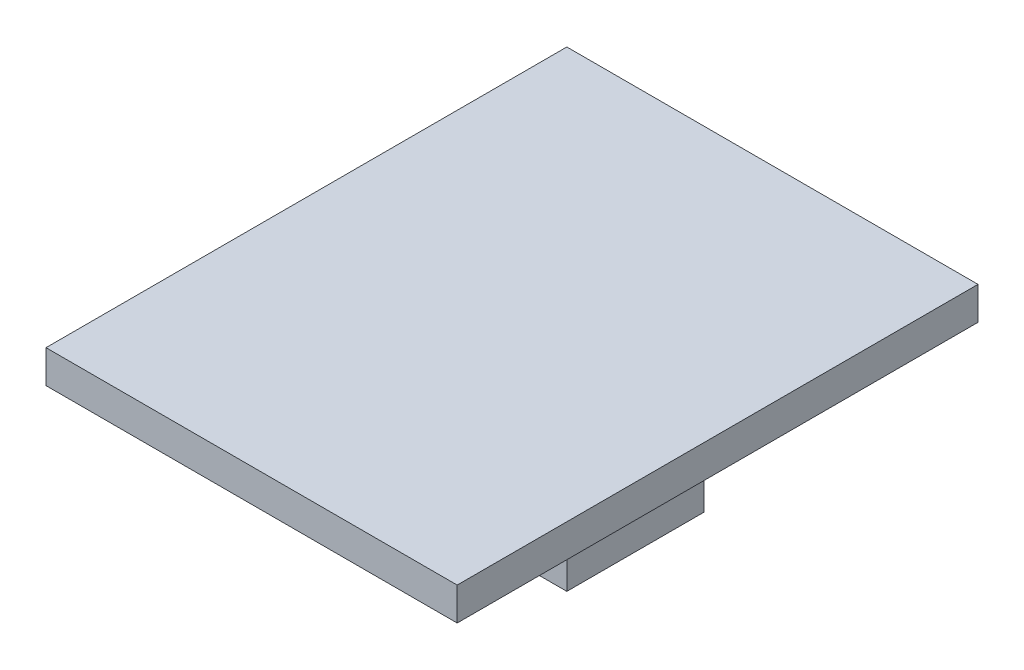
ISO-10303-21;
HEADER;
FILE_DESCRIPTION(('STEP AP214'),'2;1');
FILE_NAME('part.step','',(''),(''),'','','');
FILE_SCHEMA(('AUTOMOTIVE_DESIGN { 1 0 10303 214 1 1 1 1 }'));
ENDSEC;
DATA;
#1=APPLICATION_CONTEXT('core data for automotive mechanical design processes');
#2=APPLICATION_PROTOCOL_DEFINITION('international standard','automotive_design',2000,#1);
#3=PRODUCT_CONTEXT('',#1,'mechanical');
#4=PRODUCT('Part','Part','',(#3));
#5=PRODUCT_RELATED_PRODUCT_CATEGORY('part','',(#4));
#6=PRODUCT_DEFINITION_FORMATION('','',#4);
#7=PRODUCT_DEFINITION_CONTEXT('part definition',#1,'design');
#8=PRODUCT_DEFINITION('design','',#6,#7);
#9=PRODUCT_DEFINITION_SHAPE('','',#8);
#10=(LENGTH_UNIT() NAMED_UNIT(*) SI_UNIT(.MILLI.,.METRE.));
#11=(NAMED_UNIT(*) PLANE_ANGLE_UNIT() SI_UNIT($,.RADIAN.));
#12=(NAMED_UNIT(*) SI_UNIT($,.STERADIAN.) SOLID_ANGLE_UNIT());
#13=UNCERTAINTY_MEASURE_WITH_UNIT(LENGTH_MEASURE(1.E-05),#10,'distance_accuracy_value','');
#14=(GEOMETRIC_REPRESENTATION_CONTEXT(3) GLOBAL_UNCERTAINTY_ASSIGNED_CONTEXT((#13)) GLOBAL_UNIT_ASSIGNED_CONTEXT((#10,
#11,#12)) REPRESENTATION_CONTEXT('',''));
#15=CARTESIAN_POINT('',(0.,0.,0.));
#16=DIRECTION('',(0.,0.,1.));
#17=DIRECTION('',(1.,0.,0.));
#18=AXIS2_PLACEMENT_3D('',#15,#16,#17);
#19=CARTESIAN_POINT('',(0.,-1.2,0.));
#20=DIRECTION('',(0.,1.,0.));
#21=DIRECTION('',(0.,0.,1.));
#22=AXIS2_PLACEMENT_3D('',#19,#20,#21);
#23=PLANE('',#22);
#24=DIRECTION('',(0.,0.,1.));
#25=VECTOR('',#24,1.);
#26=CARTESIAN_POINT('',(-26.3470734694033,-1.2,0.));
#27=LINE('',#26,#25);
#28=CARTESIAN_POINT('',(-26.3470734694033,-1.2,-42.3905157228864));
#29=VERTEX_POINT('',#28);
#30=CARTESIAN_POINT('',(-26.3470734694033,-1.2,-23.3905157228864));
#31=VERTEX_POINT('',#30);
#32=EDGE_CURVE('E153',#29,#31,#27,.T.);
#33=ORIENTED_EDGE('',*,*,#32,.T.);
#34=DIRECTION('',(1.,0.,0.));
#35=VECTOR('',#34,1.);
#36=CARTESIAN_POINT('',(0.,-1.2,-23.3905157228864));
#37=LINE('',#36,#35);
#38=CARTESIAN_POINT('',(-41.3470734694033,-1.2,-23.3905157228864));
#39=VERTEX_POINT('',#38);
#40=EDGE_CURVE('E161',#39,#31,#37,.T.);
#41=ORIENTED_EDGE('',*,*,#40,.F.);
#42=DIRECTION('',(0.,0.,1.));
#43=VECTOR('',#42,1.);
#44=CARTESIAN_POINT('',(-41.3470734694033,-1.2,0.));
#45=LINE('',#44,#43);
#46=CARTESIAN_POINT('',(-41.3470734694033,-1.2,-42.3905157228864));
#47=VERTEX_POINT('',#46);
#48=EDGE_CURVE('E158',#47,#39,#45,.T.);
#49=ORIENTED_EDGE('',*,*,#48,.F.);
#50=DIRECTION('',(1.,0.,0.));
#51=VECTOR('',#50,1.);
#52=CARTESIAN_POINT('',(0.,-1.2,-42.3905157228864));
#53=LINE('',#52,#51);
#54=EDGE_CURVE('E155',#47,#29,#53,.T.);
#55=ORIENTED_EDGE('',*,*,#54,.T.);
#56=EDGE_LOOP('',(#33,#41,#49,#55));
#57=FACE_BOUND('',#56,.T.);
#58=DIRECTION('',(0.,0.,1.));
#59=VECTOR('',#58,1.);
#60=CARTESIAN_POINT('',(-36.3470734694033,-1.2,0.));
#61=LINE('',#60,#59);
#62=CARTESIAN_POINT('',(-36.3470734694033,-1.2,-37.3905157228864));
#63=VERTEX_POINT('',#62);
#64=CARTESIAN_POINT('',(-36.3470734694033,-1.2,-32.3905157228864));
#65=VERTEX_POINT('',#64);
#66=EDGE_CURVE('E340',#63,#65,#61,.T.);
#67=ORIENTED_EDGE('',*,*,#66,.T.);
#68=DIRECTION('',(1.,0.,0.));
#69=VECTOR('',#68,1.);
#70=CARTESIAN_POINT('',(0.,-1.2,-32.3905157228864));
#71=LINE('',#70,#69);
#72=CARTESIAN_POINT('',(-31.3470734694033,-1.2,-32.3905157228864));
#73=VERTEX_POINT('',#72);
#74=EDGE_CURVE('E51',#65,#73,#71,.T.);
#75=ORIENTED_EDGE('',*,*,#74,.T.);
#76=DIRECTION('',(0.,0.,1.));
#77=VECTOR('',#76,1.);
#78=CARTESIAN_POINT('',(-31.3470734694033,-1.2,0.));
#79=LINE('',#78,#77);
#80=CARTESIAN_POINT('',(-31.3470734694033,-1.2,-37.3905157228864));
#81=VERTEX_POINT('',#80);
#82=EDGE_CURVE('E345',#81,#73,#79,.T.);
#83=ORIENTED_EDGE('',*,*,#82,.F.);
#84=DIRECTION('',(1.,0.,0.));
#85=VECTOR('',#84,1.);
#86=CARTESIAN_POINT('',(0.,-1.2,-37.3905157228864));
#87=LINE('',#86,#85);
#88=EDGE_CURVE('E363',#63,#81,#87,.T.);
#89=ORIENTED_EDGE('',*,*,#88,.F.);
#90=EDGE_LOOP('',(#67,#75,#83,#89));
#91=FACE_BOUND('',#90,.T.);
#92=ADVANCED_FACE('F34',(#57,#91),#23,.F.);
#93=CARTESIAN_POINT('',(-26.3470734694033,-1.2,0.));
#94=DIRECTION('',(-1.,0.,0.));
#95=DIRECTION('',(0.,0.,1.));
#96=AXIS2_PLACEMENT_3D('',#93,#94,#95);
#97=PLANE('',#96);
#98=DIRECTION('',(0.,0.,1.));
#99=VECTOR('',#98,1.);
#100=CARTESIAN_POINT('',(-26.3470734694033,0.,0.));
#101=LINE('',#100,#99);
#102=CARTESIAN_POINT('',(-26.3470734694033,0.,-42.3905157228864));
#103=VERTEX_POINT('',#102);
#104=CARTESIAN_POINT('',(-26.3470734694033,0.,-23.3905157228864));
#105=VERTEX_POINT('',#104);
#106=EDGE_CURVE('E147',#103,#105,#101,.T.);
#107=ORIENTED_EDGE('',*,*,#106,.T.);
#108=DIRECTION('',(0.,1.,0.));
#109=VECTOR('',#108,1.);
#110=CARTESIAN_POINT('',(-26.3470734694033,-1.2,-23.3905157228864));
#111=LINE('',#110,#109);
#112=EDGE_CURVE('E11',#31,#105,#111,.T.);
#113=ORIENTED_EDGE('',*,*,#112,.F.);
#114=ORIENTED_EDGE('',*,*,#32,.F.);
#115=DIRECTION('',(0.,1.,0.));
#116=VECTOR('',#115,1.);
#117=CARTESIAN_POINT('',(-26.3470734694033,-1.2,-42.3905157228864));
#118=LINE('',#117,#116);
#119=EDGE_CURVE('E38',#29,#103,#118,.T.);
#120=ORIENTED_EDGE('',*,*,#119,.T.);
#121=EDGE_LOOP('',(#107,#113,#114,#120));
#122=FACE_BOUND('',#121,.T.);
#123=ADVANCED_FACE('F36',(#122),#97,.F.);
#124=CARTESIAN_POINT('',(0.,-1.2,-23.3905157228864));
#125=DIRECTION('',(0.,0.,1.));
#126=DIRECTION('',(1.,0.,0.));
#127=AXIS2_PLACEMENT_3D('',#124,#125,#126);
#128=PLANE('',#127);
#129=DIRECTION('',(1.,0.,0.));
#130=VECTOR('',#129,1.);
#131=CARTESIAN_POINT('',(0.,0.,-23.3905157228864));
#132=LINE('',#131,#130);
#133=CARTESIAN_POINT('',(-41.3470734694033,0.,-23.3905157228864));
#134=VERTEX_POINT('',#133);
#135=EDGE_CURVE('E156',#134,#105,#132,.T.);
#136=ORIENTED_EDGE('',*,*,#135,.F.);
#137=DIRECTION('',(0.,1.,0.));
#138=VECTOR('',#137,1.);
#139=CARTESIAN_POINT('',(-41.3470734694033,-1.2,-23.3905157228864));
#140=LINE('',#139,#138);
#141=EDGE_CURVE('E43',#39,#134,#140,.T.);
#142=ORIENTED_EDGE('',*,*,#141,.F.);
#143=ORIENTED_EDGE('',*,*,#40,.T.);
#144=ORIENTED_EDGE('',*,*,#112,.T.);
#145=EDGE_LOOP('',(#136,#142,#143,#144));
#146=FACE_BOUND('',#145,.T.);
#147=ADVANCED_FACE('F188',(#146),#128,.T.);
#148=CARTESIAN_POINT('',(-41.3470734694033,-1.2,0.));
#149=DIRECTION('',(-1.,0.,0.));
#150=DIRECTION('',(0.,0.,1.));
#151=AXIS2_PLACEMENT_3D('',#148,#149,#150);
#152=PLANE('',#151);
#153=DIRECTION('',(0.,0.,1.));
#154=VECTOR('',#153,1.);
#155=CARTESIAN_POINT('',(-41.3470734694033,0.,0.));
#156=LINE('',#155,#154);
#157=CARTESIAN_POINT('',(-41.3470734694033,0.,-42.3905157228864));
#158=VERTEX_POINT('',#157);
#159=EDGE_CURVE('E168',#158,#134,#156,.T.);
#160=ORIENTED_EDGE('',*,*,#159,.F.);
#161=DIRECTION('',(0.,1.,0.));
#162=VECTOR('',#161,1.);
#163=CARTESIAN_POINT('',(-41.3470734694033,-1.2,-42.3905157228864));
#164=LINE('',#163,#162);
#165=EDGE_CURVE('E173',#47,#158,#164,.T.);
#166=ORIENTED_EDGE('',*,*,#165,.F.);
#167=ORIENTED_EDGE('',*,*,#48,.T.);
#168=ORIENTED_EDGE('',*,*,#141,.T.);
#169=EDGE_LOOP('',(#160,#166,#167,#168));
#170=FACE_BOUND('',#169,.T.);
#171=ADVANCED_FACE('F194',(#170),#152,.T.);
#172=CARTESIAN_POINT('',(0.,-1.2,-42.3905157228864));
#173=DIRECTION('',(0.,0.,1.));
#174=DIRECTION('',(1.,0.,0.));
#175=AXIS2_PLACEMENT_3D('',#172,#173,#174);
#176=PLANE('',#175);
#177=DIRECTION('',(1.,0.,0.));
#178=VECTOR('',#177,1.);
#179=CARTESIAN_POINT('',(0.,0.,-42.3905157228864));
#180=LINE('',#179,#178);
#181=EDGE_CURVE('E166',#158,#103,#180,.T.);
#182=ORIENTED_EDGE('',*,*,#181,.T.);
#183=ORIENTED_EDGE('',*,*,#119,.F.);
#184=ORIENTED_EDGE('',*,*,#54,.F.);
#185=ORIENTED_EDGE('',*,*,#165,.T.);
#186=EDGE_LOOP('',(#182,#183,#184,#185));
#187=FACE_BOUND('',#186,.T.);
#188=ADVANCED_FACE('F192',(#187),#176,.F.);
#189=CARTESIAN_POINT('',(0.,0.,0.));
#190=DIRECTION('',(0.,1.,0.));
#191=DIRECTION('',(0.,0.,1.));
#192=AXIS2_PLACEMENT_3D('',#189,#190,#191);
#193=PLANE('',#192);
#194=ORIENTED_EDGE('',*,*,#106,.F.);
#195=ORIENTED_EDGE('',*,*,#181,.F.);
#196=ORIENTED_EDGE('',*,*,#159,.T.);
#197=ORIENTED_EDGE('',*,*,#135,.T.);
#198=EDGE_LOOP('',(#194,#195,#196,#197));
#199=FACE_BOUND('',#198,.T.);
#200=ADVANCED_FACE('F184',(#199),#193,.T.);
#201=CARTESIAN_POINT('',(-31.3470734694033,-7.2,0.));
#202=DIRECTION('',(-1.,0.,0.));
#203=DIRECTION('',(0.,0.,1.));
#204=AXIS2_PLACEMENT_3D('',#201,#202,#203);
#205=PLANE('',#204);
#206=ORIENTED_EDGE('',*,*,#82,.T.);
#207=DIRECTION('',(0.,1.,0.));
#208=VECTOR('',#207,1.);
#209=CARTESIAN_POINT('',(-31.3470734694033,-7.2,-32.3905157228864));
#210=LINE('',#209,#208);
#211=CARTESIAN_POINT('',(-31.3470734694033,-7.2,-32.3905157228864));
#212=VERTEX_POINT('',#211);
#213=EDGE_CURVE('E144',#212,#73,#210,.T.);
#214=ORIENTED_EDGE('',*,*,#213,.F.);
#215=DIRECTION('',(0.,0.,1.));
#216=VECTOR('',#215,1.);
#217=CARTESIAN_POINT('',(-31.3470734694033,-7.2,0.));
#218=LINE('',#217,#216);
#219=CARTESIAN_POINT('',(-31.3470734694033,-7.2,-37.3905157228864));
#220=VERTEX_POINT('',#219);
#221=EDGE_CURVE('E360',#220,#212,#218,.T.);
#222=ORIENTED_EDGE('',*,*,#221,.F.);
#223=DIRECTION('',(0.,1.,0.));
#224=VECTOR('',#223,1.);
#225=CARTESIAN_POINT('',(-31.3470734694033,-7.2,-37.3905157228864));
#226=LINE('',#225,#224);
#227=EDGE_CURVE('E149',#220,#81,#226,.T.);
#228=ORIENTED_EDGE('',*,*,#227,.T.);
#229=EDGE_LOOP('',(#206,#214,#222,#228));
#230=FACE_BOUND('',#229,.T.);
#231=ADVANCED_FACE('F199',(#230),#205,.F.);
#232=CARTESIAN_POINT('',(0.,-7.2,-32.3905157228864));
#233=DIRECTION('',(0.,0.,1.));
#234=DIRECTION('',(1.,0.,0.));
#235=AXIS2_PLACEMENT_3D('',#232,#233,#234);
#236=PLANE('',#235);
#237=ORIENTED_EDGE('',*,*,#74,.F.);
#238=DIRECTION('',(0.,1.,0.));
#239=VECTOR('',#238,1.);
#240=CARTESIAN_POINT('',(-36.3470734694033,-7.2,-32.3905157228864));
#241=LINE('',#240,#239);
#242=CARTESIAN_POINT('',(-36.3470734694033,-7.2,-32.3905157228864));
#243=VERTEX_POINT('',#242);
#244=EDGE_CURVE('E357',#243,#65,#241,.T.);
#245=ORIENTED_EDGE('',*,*,#244,.F.);
#246=DIRECTION('',(1.,0.,0.));
#247=VECTOR('',#246,1.);
#248=CARTESIAN_POINT('',(0.,-7.2,-32.3905157228864));
#249=LINE('',#248,#247);
#250=CARTESIAN_POINT('',(-35.3470734694033,-7.2,-32.3905157228864));
#251=VERTEX_POINT('',#250);
#252=EDGE_CURVE('E347',#243,#251,#249,.T.);
#253=ORIENTED_EDGE('',*,*,#252,.T.);
#254=DIRECTION('',(0.,1.,0.));
#255=VECTOR('',#254,1.);
#256=CARTESIAN_POINT('',(-35.3470734694033,-7.2,-32.3905157228864));
#257=LINE('',#256,#255);
#258=CARTESIAN_POINT('',(-35.3470734694033,-3.2,-32.3905157228864));
#259=VERTEX_POINT('',#258);
#260=EDGE_CURVE('E138',#251,#259,#257,.T.);
#261=ORIENTED_EDGE('',*,*,#260,.T.);
#262=DIRECTION('',(1.,0.,0.));
#263=VECTOR('',#262,1.);
#264=CARTESIAN_POINT('',(0.,-3.2,-32.3905157228864));
#265=LINE('',#264,#263);
#266=CARTESIAN_POINT('',(-32.3470734694033,-3.2,-32.3905157228864));
#267=VERTEX_POINT('',#266);
#268=EDGE_CURVE('E124',#259,#267,#265,.T.);
#269=ORIENTED_EDGE('',*,*,#268,.T.);
#270=DIRECTION('',(0.,1.,0.));
#271=VECTOR('',#270,1.);
#272=CARTESIAN_POINT('',(-32.3470734694033,-7.2,-32.3905157228864));
#273=LINE('',#272,#271);
#274=CARTESIAN_POINT('',(-32.3470734694033,-7.2,-32.3905157228864));
#275=VERTEX_POINT('',#274);
#276=EDGE_CURVE('E135',#275,#267,#273,.T.);
#277=ORIENTED_EDGE('',*,*,#276,.F.);
#278=DIRECTION('',(1.,0.,0.));
#279=VECTOR('',#278,1.);
#280=CARTESIAN_POINT('',(0.,-7.2,-32.3905157228864));
#281=LINE('',#280,#279);
#282=EDGE_CURVE('E362',#275,#212,#281,.T.);
#283=ORIENTED_EDGE('',*,*,#282,.T.);
#284=ORIENTED_EDGE('',*,*,#213,.T.);
#285=EDGE_LOOP('',(#237,#245,#253,#261,#269,#277,#283,#284));
#286=FACE_BOUND('',#285,.T.);
#287=ADVANCED_FACE('F133',(#286),#236,.T.);
#288=CARTESIAN_POINT('',(-32.3470734694033,-7.2,0.));
#289=DIRECTION('',(-1.,0.,0.));
#290=DIRECTION('',(0.,0.,1.));
#291=AXIS2_PLACEMENT_3D('',#288,#289,#290);
#292=PLANE('',#291);
#293=DIRECTION('',(0.,0.,1.));
#294=VECTOR('',#293,1.);
#295=CARTESIAN_POINT('',(-32.3470734694033,-3.2,0.));
#296=LINE('',#295,#294);
#297=CARTESIAN_POINT('',(-32.3470734694033,-3.2,-37.3905157228864));
#298=VERTEX_POINT('',#297);
#299=EDGE_CURVE('E121',#298,#267,#296,.T.);
#300=ORIENTED_EDGE('',*,*,#299,.F.);
#301=DIRECTION('',(0.,1.,0.));
#302=VECTOR('',#301,1.);
#303=CARTESIAN_POINT('',(-32.3470734694033,-7.2,-37.3905157228864));
#304=LINE('',#303,#302);
#305=CARTESIAN_POINT('',(-32.3470734694033,-7.2,-37.3905157228864));
#306=VERTEX_POINT('',#305);
#307=EDGE_CURVE('E145',#306,#298,#304,.T.);
#308=ORIENTED_EDGE('',*,*,#307,.F.);
#309=DIRECTION('',(0.,0.,1.));
#310=VECTOR('',#309,1.);
#311=CARTESIAN_POINT('',(-32.3470734694033,-7.2,0.));
#312=LINE('',#311,#310);
#313=EDGE_CURVE('E143',#306,#275,#312,.T.);
#314=ORIENTED_EDGE('',*,*,#313,.T.);
#315=ORIENTED_EDGE('',*,*,#276,.T.);
#316=EDGE_LOOP('',(#300,#308,#314,#315));
#317=FACE_BOUND('',#316,.T.);
#318=ADVANCED_FACE('F141',(#317),#292,.T.);
#319=CARTESIAN_POINT('',(0.,-7.2,-37.3905157228864));
#320=DIRECTION('',(0.,0.,1.));
#321=DIRECTION('',(1.,0.,0.));
#322=AXIS2_PLACEMENT_3D('',#319,#320,#321);
#323=PLANE('',#322);
#324=ORIENTED_EDGE('',*,*,#88,.T.);
#325=ORIENTED_EDGE('',*,*,#227,.F.);
#326=DIRECTION('',(1.,0.,0.));
#327=VECTOR('',#326,1.);
#328=CARTESIAN_POINT('',(0.,-7.2,-37.3905157228864));
#329=LINE('',#328,#327);
#330=EDGE_CURVE('E366',#306,#220,#329,.T.);
#331=ORIENTED_EDGE('',*,*,#330,.F.);
#332=ORIENTED_EDGE('',*,*,#307,.T.);
#333=DIRECTION('',(1.,0.,0.));
#334=VECTOR('',#333,1.);
#335=CARTESIAN_POINT('',(0.,-3.2,-37.3905157228864));
#336=LINE('',#335,#334);
#337=CARTESIAN_POINT('',(-35.3470734694033,-3.2,-37.3905157228864));
#338=VERTEX_POINT('',#337);
#339=EDGE_CURVE('E127',#338,#298,#336,.T.);
#340=ORIENTED_EDGE('',*,*,#339,.F.);
#341=DIRECTION('',(0.,1.,0.));
#342=VECTOR('',#341,1.);
#343=CARTESIAN_POINT('',(-35.3470734694033,-7.2,-37.3905157228864));
#344=LINE('',#343,#342);
#345=CARTESIAN_POINT('',(-35.3470734694033,-7.2,-37.3905157228864));
#346=VERTEX_POINT('',#345);
#347=EDGE_CURVE('E343',#346,#338,#344,.T.);
#348=ORIENTED_EDGE('',*,*,#347,.F.);
#349=DIRECTION('',(1.,0.,0.));
#350=VECTOR('',#349,1.);
#351=CARTESIAN_POINT('',(0.,-7.2,-37.3905157228864));
#352=LINE('',#351,#350);
#353=CARTESIAN_POINT('',(-36.3470734694033,-7.2,-37.3905157228864));
#354=VERTEX_POINT('',#353);
#355=EDGE_CURVE('E332',#354,#346,#352,.T.);
#356=ORIENTED_EDGE('',*,*,#355,.F.);
#357=DIRECTION('',(0.,1.,0.));
#358=VECTOR('',#357,1.);
#359=CARTESIAN_POINT('',(-36.3470734694033,-7.2,-37.3905157228864));
#360=LINE('',#359,#358);
#361=EDGE_CURVE('E353',#354,#63,#360,.T.);
#362=ORIENTED_EDGE('',*,*,#361,.T.);
#363=EDGE_LOOP('',(#324,#325,#331,#332,#340,#348,#356,#362));
#364=FACE_BOUND('',#363,.T.);
#365=ADVANCED_FACE('F263',(#364),#323,.F.);
#366=CARTESIAN_POINT('',(0.,-7.2,0.));
#367=DIRECTION('',(0.,1.,0.));
#368=DIRECTION('',(0.,0.,1.));
#369=AXIS2_PLACEMENT_3D('',#366,#367,#368);
#370=PLANE('',#369);
#371=ORIENTED_EDGE('',*,*,#221,.T.);
#372=ORIENTED_EDGE('',*,*,#282,.F.);
#373=ORIENTED_EDGE('',*,*,#313,.F.);
#374=ORIENTED_EDGE('',*,*,#330,.T.);
#375=EDGE_LOOP('',(#371,#372,#373,#374));
#376=FACE_BOUND('',#375,.T.);
#377=ADVANCED_FACE('F272',(#376),#370,.F.);
#378=CARTESIAN_POINT('',(-35.3470734694033,-7.2,0.));
#379=DIRECTION('',(1.,0.,0.));
#380=DIRECTION('',(0.,0.,-1.));
#381=AXIS2_PLACEMENT_3D('',#378,#379,#380);
#382=PLANE('',#381);
#383=DIRECTION('',(0.,0.,-1.));
#384=VECTOR('',#383,1.);
#385=CARTESIAN_POINT('',(-35.3470734694033,-3.2,0.));
#386=LINE('',#385,#384);
#387=EDGE_CURVE('E355',#259,#338,#386,.T.);
#388=ORIENTED_EDGE('',*,*,#387,.F.);
#389=ORIENTED_EDGE('',*,*,#260,.F.);
#390=DIRECTION('',(0.,0.,-1.));
#391=VECTOR('',#390,1.);
#392=CARTESIAN_POINT('',(-35.3470734694033,-7.2,0.));
#393=LINE('',#392,#391);
#394=EDGE_CURVE('E336',#251,#346,#393,.T.);
#395=ORIENTED_EDGE('',*,*,#394,.T.);
#396=ORIENTED_EDGE('',*,*,#347,.T.);
#397=EDGE_LOOP('',(#388,#389,#395,#396));
#398=FACE_BOUND('',#397,.T.);
#399=ADVANCED_FACE('F288',(#398),#382,.T.);
#400=CARTESIAN_POINT('',(-36.3470734694033,-7.2,0.));
#401=DIRECTION('',(-1.,0.,0.));
#402=DIRECTION('',(0.,0.,1.));
#403=AXIS2_PLACEMENT_3D('',#400,#401,#402);
#404=PLANE('',#403);
#405=ORIENTED_EDGE('',*,*,#66,.F.);
#406=ORIENTED_EDGE('',*,*,#361,.F.);
#407=DIRECTION('',(0.,0.,1.));
#408=VECTOR('',#407,1.);
#409=CARTESIAN_POINT('',(-36.3470734694033,-7.2,0.));
#410=LINE('',#409,#408);
#411=EDGE_CURVE('E338',#354,#243,#410,.T.);
#412=ORIENTED_EDGE('',*,*,#411,.T.);
#413=ORIENTED_EDGE('',*,*,#244,.T.);
#414=EDGE_LOOP('',(#405,#406,#412,#413));
#415=FACE_BOUND('',#414,.T.);
#416=ADVANCED_FACE('F298',(#415),#404,.T.);
#417=CARTESIAN_POINT('',(0.,-7.2,0.));
#418=DIRECTION('',(0.,1.,0.));
#419=DIRECTION('',(0.,0.,1.));
#420=AXIS2_PLACEMENT_3D('',#417,#418,#419);
#421=PLANE('',#420);
#422=ORIENTED_EDGE('',*,*,#355,.T.);
#423=ORIENTED_EDGE('',*,*,#394,.F.);
#424=ORIENTED_EDGE('',*,*,#252,.F.);
#425=ORIENTED_EDGE('',*,*,#411,.F.);
#426=EDGE_LOOP('',(#422,#423,#424,#425));
#427=FACE_BOUND('',#426,.T.);
#428=ADVANCED_FACE('F308',(#427),#421,.F.);
#429=CARTESIAN_POINT('',(0.,-3.2,0.));
#430=DIRECTION('',(0.,-1.,0.));
#431=DIRECTION('',(0.,0.,-1.));
#432=AXIS2_PLACEMENT_3D('',#429,#430,#431);
#433=PLANE('',#432);
#434=ORIENTED_EDGE('',*,*,#268,.F.);
#435=ORIENTED_EDGE('',*,*,#387,.T.);
#436=ORIENTED_EDGE('',*,*,#339,.T.);
#437=ORIENTED_EDGE('',*,*,#299,.T.);
#438=EDGE_LOOP('',(#434,#435,#436,#437));
#439=FACE_BOUND('',#438,.T.);
#440=ADVANCED_FACE('F123',(#439),#433,.T.);
#441=CLOSED_SHELL('',(#92,#123,#147,#171,#188,#200,#231,#287,#318,#365,#377,#399,#416,#428,#440));
#442=MANIFOLD_SOLID_BREP('B2',#441);
#443=ADVANCED_BREP_SHAPE_REPRESENTATION('',(#18,#442),#14);
#444=SHAPE_DEFINITION_REPRESENTATION(#9,#443);
ENDSEC;
END-ISO-10303-21;
